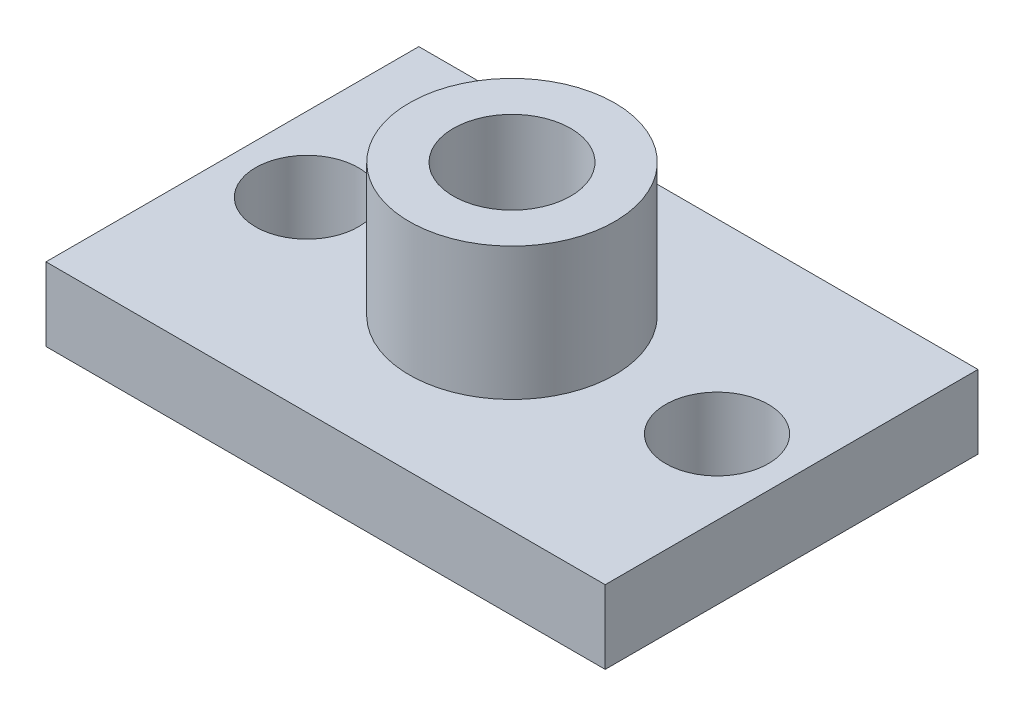
ISO-10303-21;
HEADER;
FILE_DESCRIPTION(('STEP AP214'),'2;1');
FILE_NAME('part.step','',(''),(''),'','','');
FILE_SCHEMA(('AUTOMOTIVE_DESIGN { 1 0 10303 214 1 1 1 1 }'));
ENDSEC;
DATA;
#1=APPLICATION_CONTEXT('core data for automotive mechanical design processes');
#2=APPLICATION_PROTOCOL_DEFINITION('international standard','automotive_design',2000,#1);
#3=PRODUCT_CONTEXT('',#1,'mechanical');
#4=PRODUCT('Part','Part','',(#3));
#5=PRODUCT_RELATED_PRODUCT_CATEGORY('part','',(#4));
#6=PRODUCT_DEFINITION_FORMATION('','',#4);
#7=PRODUCT_DEFINITION_CONTEXT('part definition',#1,'design');
#8=PRODUCT_DEFINITION('design','',#6,#7);
#9=PRODUCT_DEFINITION_SHAPE('','',#8);
#10=(LENGTH_UNIT() NAMED_UNIT(*) SI_UNIT(.MILLI.,.METRE.));
#11=(NAMED_UNIT(*) PLANE_ANGLE_UNIT() SI_UNIT($,.RADIAN.));
#12=(NAMED_UNIT(*) SI_UNIT($,.STERADIAN.) SOLID_ANGLE_UNIT());
#13=UNCERTAINTY_MEASURE_WITH_UNIT(LENGTH_MEASURE(1.E-05),#10,'distance_accuracy_value','');
#14=(GEOMETRIC_REPRESENTATION_CONTEXT(3) GLOBAL_UNCERTAINTY_ASSIGNED_CONTEXT((#13)) GLOBAL_UNIT_ASSIGNED_CONTEXT((#10,
#11,#12)) REPRESENTATION_CONTEXT('',''));
#15=CARTESIAN_POINT('',(0.,0.,0.));
#16=DIRECTION('',(0.,0.,1.));
#17=DIRECTION('',(1.,0.,0.));
#18=AXIS2_PLACEMENT_3D('',#15,#16,#17);
#19=CARTESIAN_POINT('',(0.,5.,0.));
#20=DIRECTION('',(0.,1.,0.));
#21=DIRECTION('',(0.,0.,1.));
#22=AXIS2_PLACEMENT_3D('',#19,#20,#21);
#23=PLANE('',#22);
#24=CARTESIAN_POINT('',(-20.7617391304348,5.,0.));
#25=DIRECTION('',(0.,1.,0.));
#26=DIRECTION('',(0.,0.,1.));
#27=AXIS2_PLACEMENT_3D('',#24,#25,#26);
#28=CIRCLE('',#27,3.5);
#29=CARTESIAN_POINT('',(-20.7617391304348,5.,3.5));
#30=VERTEX_POINT('',#29);
#31=EDGE_CURVE('E166',#30,#30,#28,.T.);
#32=ORIENTED_EDGE('',*,*,#31,.F.);
#33=EDGE_LOOP('',(#32));
#34=FACE_BOUND('',#33,.T.);
#35=CARTESIAN_POINT('',(7.17826086956524,5.,0.));
#36=DIRECTION('',(0.,1.,0.));
#37=DIRECTION('',(0.,0.,1.));
#38=AXIS2_PLACEMENT_3D('',#35,#36,#37);
#39=CIRCLE('',#38,3.5);
#40=CARTESIAN_POINT('',(7.17826086956524,5.,3.5));
#41=VERTEX_POINT('',#40);
#42=EDGE_CURVE('E168',#41,#41,#39,.T.);
#43=ORIENTED_EDGE('',*,*,#42,.F.);
#44=EDGE_LOOP('',(#43));
#45=FACE_BOUND('',#44,.T.);
#46=DIRECTION('',(0.,0.,1.));
#47=VECTOR('',#46,1.);
#48=CARTESIAN_POINT('',(-25.8417391304348,5.,-12.7));
#49=LINE('',#48,#47);
#50=CARTESIAN_POINT('',(-25.8417391304348,5.,-12.7));
#51=VERTEX_POINT('',#50);
#52=CARTESIAN_POINT('',(-25.8417391304348,5.,12.7));
#53=VERTEX_POINT('',#52);
#54=EDGE_CURVE('E86',#51,#53,#49,.T.);
#55=ORIENTED_EDGE('',*,*,#54,.T.);
#56=DIRECTION('',(1.,0.,0.));
#57=VECTOR('',#56,1.);
#58=CARTESIAN_POINT('',(-25.8417391304348,5.,12.7));
#59=LINE('',#58,#57);
#60=CARTESIAN_POINT('',(12.2582608695652,5.,12.7));
#61=VERTEX_POINT('',#60);
#62=EDGE_CURVE('E81',#53,#61,#59,.T.);
#63=ORIENTED_EDGE('',*,*,#62,.T.);
#64=DIRECTION('',(0.,0.,-1.));
#65=VECTOR('',#64,1.);
#66=CARTESIAN_POINT('',(12.2582608695652,5.,-12.7));
#67=LINE('',#66,#65);
#68=CARTESIAN_POINT('',(12.2582608695652,5.,-12.7));
#69=VERTEX_POINT('',#68);
#70=EDGE_CURVE('E84',#61,#69,#67,.T.);
#71=ORIENTED_EDGE('',*,*,#70,.T.);
#72=DIRECTION('',(-1.,0.,0.));
#73=VECTOR('',#72,1.);
#74=CARTESIAN_POINT('',(-25.8417391304348,5.,-12.7));
#75=LINE('',#74,#73);
#76=EDGE_CURVE('E50',#69,#51,#75,.T.);
#77=ORIENTED_EDGE('',*,*,#76,.T.);
#78=EDGE_LOOP('',(#55,#63,#71,#77));
#79=FACE_BOUND('',#78,.T.);
#80=CARTESIAN_POINT('',(-6.79173913043476,5.,0.));
#81=DIRECTION('',(0.,1.,0.));
#82=DIRECTION('',(0.,0.,1.));
#83=AXIS2_PLACEMENT_3D('',#80,#81,#82);
#84=CIRCLE('',#83,7.);
#85=CARTESIAN_POINT('',(-6.79173913043476,5.,-7.00000000000001));
#86=VERTEX_POINT('',#85);
#87=EDGE_CURVE('E178',#86,#86,#84,.T.);
#88=ORIENTED_EDGE('',*,*,#87,.F.);
#89=EDGE_LOOP('',(#88));
#90=FACE_BOUND('',#89,.T.);
#91=ADVANCED_FACE('F33',(#34,#45,#79,#90),#23,.T.);
#92=CARTESIAN_POINT('',(-25.8417391304348,5.,-12.7));
#93=DIRECTION('',(1.,0.,0.));
#94=DIRECTION('',(0.,0.,-1.));
#95=AXIS2_PLACEMENT_3D('',#92,#93,#94);
#96=PLANE('',#95);
#97=DIRECTION('',(0.,0.,1.));
#98=VECTOR('',#97,1.);
#99=CARTESIAN_POINT('',(-25.8417391304348,0.,-12.7));
#100=LINE('',#99,#98);
#101=CARTESIAN_POINT('',(-25.8417391304348,0.,-12.7));
#102=VERTEX_POINT('',#101);
#103=CARTESIAN_POINT('',(-25.8417391304348,0.,12.7));
#104=VERTEX_POINT('',#103);
#105=EDGE_CURVE('E100',#102,#104,#100,.T.);
#106=ORIENTED_EDGE('',*,*,#105,.T.);
#107=DIRECTION('',(0.,-1.,0.));
#108=VECTOR('',#107,1.);
#109=CARTESIAN_POINT('',(-25.8417391304348,5.,12.7));
#110=LINE('',#109,#108);
#111=EDGE_CURVE('E42',#53,#104,#110,.T.);
#112=ORIENTED_EDGE('',*,*,#111,.F.);
#113=ORIENTED_EDGE('',*,*,#54,.F.);
#114=DIRECTION('',(0.,-1.,0.));
#115=VECTOR('',#114,1.);
#116=CARTESIAN_POINT('',(-25.8417391304348,5.,-12.7));
#117=LINE('',#116,#115);
#118=EDGE_CURVE('E96',#51,#102,#117,.T.);
#119=ORIENTED_EDGE('',*,*,#118,.T.);
#120=EDGE_LOOP('',(#106,#112,#113,#119));
#121=FACE_BOUND('',#120,.T.);
#122=ADVANCED_FACE('F35',(#121),#96,.F.);
#123=CARTESIAN_POINT('',(-25.8417391304348,5.,12.7));
#124=DIRECTION('',(0.,0.,-1.));
#125=DIRECTION('',(-1.,0.,0.));
#126=AXIS2_PLACEMENT_3D('',#123,#124,#125);
#127=PLANE('',#126);
#128=DIRECTION('',(1.,0.,0.));
#129=VECTOR('',#128,1.);
#130=CARTESIAN_POINT('',(-25.8417391304348,0.,12.7));
#131=LINE('',#130,#129);
#132=CARTESIAN_POINT('',(12.2582608695652,0.,12.7));
#133=VERTEX_POINT('',#132);
#134=EDGE_CURVE('E91',#104,#133,#131,.T.);
#135=ORIENTED_EDGE('',*,*,#134,.T.);
#136=DIRECTION('',(0.,-1.,0.));
#137=VECTOR('',#136,1.);
#138=CARTESIAN_POINT('',(12.2582608695652,5.,12.7));
#139=LINE('',#138,#137);
#140=EDGE_CURVE('E89',#61,#133,#139,.T.);
#141=ORIENTED_EDGE('',*,*,#140,.F.);
#142=ORIENTED_EDGE('',*,*,#62,.F.);
#143=ORIENTED_EDGE('',*,*,#111,.T.);
#144=EDGE_LOOP('',(#135,#141,#142,#143));
#145=FACE_BOUND('',#144,.T.);
#146=ADVANCED_FACE('F90',(#145),#127,.F.);
#147=CARTESIAN_POINT('',(12.2582608695652,5.,-12.7));
#148=DIRECTION('',(-1.,0.,0.));
#149=DIRECTION('',(0.,0.,1.));
#150=AXIS2_PLACEMENT_3D('',#147,#148,#149);
#151=PLANE('',#150);
#152=DIRECTION('',(0.,0.,-1.));
#153=VECTOR('',#152,1.);
#154=CARTESIAN_POINT('',(12.2582608695652,0.,-12.7));
#155=LINE('',#154,#153);
#156=CARTESIAN_POINT('',(12.2582608695652,0.,-12.7));
#157=VERTEX_POINT('',#156);
#158=EDGE_CURVE('E67',#133,#157,#155,.T.);
#159=ORIENTED_EDGE('',*,*,#158,.T.);
#160=DIRECTION('',(0.,-1.,0.));
#161=VECTOR('',#160,1.);
#162=CARTESIAN_POINT('',(12.2582608695652,5.,-12.7));
#163=LINE('',#162,#161);
#164=EDGE_CURVE('E92',#69,#157,#163,.T.);
#165=ORIENTED_EDGE('',*,*,#164,.F.);
#166=ORIENTED_EDGE('',*,*,#70,.F.);
#167=ORIENTED_EDGE('',*,*,#140,.T.);
#168=EDGE_LOOP('',(#159,#165,#166,#167));
#169=FACE_BOUND('',#168,.T.);
#170=ADVANCED_FACE('F94',(#169),#151,.F.);
#171=CARTESIAN_POINT('',(-25.8417391304348,5.,-12.7));
#172=DIRECTION('',(0.,0.,1.));
#173=DIRECTION('',(1.,0.,0.));
#174=AXIS2_PLACEMENT_3D('',#171,#172,#173);
#175=PLANE('',#174);
#176=DIRECTION('',(-1.,0.,0.));
#177=VECTOR('',#176,1.);
#178=CARTESIAN_POINT('',(-25.8417391304348,0.,-12.7));
#179=LINE('',#178,#177);
#180=EDGE_CURVE('E73',#157,#102,#179,.T.);
#181=ORIENTED_EDGE('',*,*,#180,.T.);
#182=ORIENTED_EDGE('',*,*,#118,.F.);
#183=ORIENTED_EDGE('',*,*,#76,.F.);
#184=ORIENTED_EDGE('',*,*,#164,.T.);
#185=EDGE_LOOP('',(#181,#182,#183,#184));
#186=FACE_BOUND('',#185,.T.);
#187=ADVANCED_FACE('F114',(#186),#175,.F.);
#188=CARTESIAN_POINT('',(0.,0.,0.));
#189=DIRECTION('',(0.,1.,0.));
#190=DIRECTION('',(0.,0.,1.));
#191=AXIS2_PLACEMENT_3D('',#188,#189,#190);
#192=PLANE('',#191);
#193=CARTESIAN_POINT('',(-20.7617391304348,0.,0.));
#194=DIRECTION('',(0.,1.,0.));
#195=DIRECTION('',(0.,0.,1.));
#196=AXIS2_PLACEMENT_3D('',#193,#194,#195);
#197=CIRCLE('',#196,3.5);
#198=CARTESIAN_POINT('',(-20.7617391304348,0.,3.5));
#199=VERTEX_POINT('',#198);
#200=EDGE_CURVE('E164',#199,#199,#197,.T.);
#201=ORIENTED_EDGE('',*,*,#200,.T.);
#202=EDGE_LOOP('',(#201));
#203=FACE_BOUND('',#202,.T.);
#204=CARTESIAN_POINT('',(7.17826086956524,0.,0.));
#205=DIRECTION('',(0.,1.,0.));
#206=DIRECTION('',(0.,0.,1.));
#207=AXIS2_PLACEMENT_3D('',#204,#205,#206);
#208=CIRCLE('',#207,3.5);
#209=CARTESIAN_POINT('',(7.17826086956524,0.,3.5));
#210=VERTEX_POINT('',#209);
#211=EDGE_CURVE('E171',#210,#210,#208,.T.);
#212=ORIENTED_EDGE('',*,*,#211,.T.);
#213=EDGE_LOOP('',(#212));
#214=FACE_BOUND('',#213,.T.);
#215=ORIENTED_EDGE('',*,*,#105,.F.);
#216=ORIENTED_EDGE('',*,*,#180,.F.);
#217=ORIENTED_EDGE('',*,*,#158,.F.);
#218=ORIENTED_EDGE('',*,*,#134,.F.);
#219=EDGE_LOOP('',(#215,#216,#217,#218));
#220=FACE_BOUND('',#219,.T.);
#221=ADVANCED_FACE('F111',(#203,#214,#220),#192,.F.);
#222=CARTESIAN_POINT('',(-6.79173913043476,14.05,0.));
#223=DIRECTION('',(0.,1.,0.));
#224=DIRECTION('',(0.,0.,1.));
#225=AXIS2_PLACEMENT_3D('',#222,#223,#224);
#226=PLANE('',#225);
#227=CARTESIAN_POINT('',(-6.79173913043476,14.05,0.));
#228=DIRECTION('',(0.,1.,0.));
#229=DIRECTION('',(0.,0.,1.));
#230=AXIS2_PLACEMENT_3D('',#227,#228,#229);
#231=CIRCLE('',#230,7.);
#232=CARTESIAN_POINT('',(-6.79173913043476,14.05,-7.00000000000001));
#233=VERTEX_POINT('',#232);
#234=EDGE_CURVE('E103',#233,#233,#231,.T.);
#235=ORIENTED_EDGE('',*,*,#234,.T.);
#236=EDGE_LOOP('',(#235));
#237=FACE_BOUND('',#236,.T.);
#238=CARTESIAN_POINT('',(-6.79173913043476,14.05,0.));
#239=DIRECTION('',(0.,1.,0.));
#240=DIRECTION('',(0.,0.,1.));
#241=AXIS2_PLACEMENT_3D('',#238,#239,#240);
#242=CIRCLE('',#241,4.);
#243=CARTESIAN_POINT('',(-6.79173913043476,14.05,-4.00000000000001));
#244=VERTEX_POINT('',#243);
#245=EDGE_CURVE('E174',#244,#244,#242,.T.);
#246=ORIENTED_EDGE('',*,*,#245,.F.);
#247=EDGE_LOOP('',(#246));
#248=FACE_BOUND('',#247,.T.);
#249=ADVANCED_FACE('F113',(#237,#248),#226,.T.);
#250=CARTESIAN_POINT('',(-6.79173913043476,14.05,0.));
#251=DIRECTION('',(0.,-1.,0.));
#252=DIRECTION('',(0.,0.,-1.));
#253=AXIS2_PLACEMENT_3D('',#250,#251,#252);
#254=CYLINDRICAL_SURFACE('',#253,7.);
#255=CARTESIAN_POINT('',(-6.79173913043476,14.05,-7.00000000000001));
#256=CARTESIAN_POINT('',(-6.79173913043476,13.9557291666667,-7.00000000000001));
#257=CARTESIAN_POINT('',(-6.79173913043476,13.8614583333333,-7.00000000000001));
#258=CARTESIAN_POINT('',(-6.79173913043476,13.6729166666667,-7.00000000000001));
#259=CARTESIAN_POINT('',(-6.79173913043476,13.5786458333333,-7.00000000000001));
#260=CARTESIAN_POINT('',(-6.79173913043476,13.3901041666667,-7.00000000000001));
#261=CARTESIAN_POINT('',(-6.79173913043476,13.2958333333333,-7.00000000000001));
#262=CARTESIAN_POINT('',(-6.79173913043476,13.1072916666667,-7.00000000000001));
#263=CARTESIAN_POINT('',(-6.79173913043476,13.0130208333333,-7.00000000000001));
#264=CARTESIAN_POINT('',(-6.79173913043476,12.8244791666667,-7.00000000000001));
#265=CARTESIAN_POINT('',(-6.79173913043476,12.7302083333333,-7.00000000000001));
#266=CARTESIAN_POINT('',(-6.79173913043476,12.5416666666667,-7.00000000000001));
#267=CARTESIAN_POINT('',(-6.79173913043476,12.4473958333333,-7.00000000000001));
#268=CARTESIAN_POINT('',(-6.79173913043476,12.2588541666667,-7.00000000000001));
#269=CARTESIAN_POINT('',(-6.79173913043476,12.1645833333333,-7.00000000000001));
#270=CARTESIAN_POINT('',(-6.79173913043476,11.9760416666667,-7.00000000000001));
#271=CARTESIAN_POINT('',(-6.79173913043476,11.8817708333333,-7.00000000000001));
#272=CARTESIAN_POINT('',(-6.79173913043476,11.6932291666667,-7.00000000000001));
#273=CARTESIAN_POINT('',(-6.79173913043476,11.5989583333333,-7.00000000000001));
#274=CARTESIAN_POINT('',(-6.79173913043476,11.4104166666667,-7.00000000000001));
#275=CARTESIAN_POINT('',(-6.79173913043476,11.3161458333333,-7.00000000000001));
#276=CARTESIAN_POINT('',(-6.79173913043476,11.1276041666667,-7.00000000000001));
#277=CARTESIAN_POINT('',(-6.79173913043476,11.0333333333333,-7.00000000000001));
#278=CARTESIAN_POINT('',(-6.79173913043476,10.8447916666667,-7.00000000000001));
#279=CARTESIAN_POINT('',(-6.79173913043476,10.7505208333333,-7.00000000000001));
#280=CARTESIAN_POINT('',(-6.79173913043476,10.5619791666667,-7.00000000000001));
#281=CARTESIAN_POINT('',(-6.79173913043476,10.4677083333333,-7.00000000000001));
#282=CARTESIAN_POINT('',(-6.79173913043476,10.2791666666667,-7.00000000000001));
#283=CARTESIAN_POINT('',(-6.79173913043476,10.1848958333333,-7.00000000000001));
#284=CARTESIAN_POINT('',(-6.79173913043476,9.99635416666667,-7.00000000000001));
#285=CARTESIAN_POINT('',(-6.79173913043476,9.90208333333333,-7.00000000000001));
#286=CARTESIAN_POINT('',(-6.79173913043476,9.71354166666667,-7.00000000000001));
#287=CARTESIAN_POINT('',(-6.79173913043476,9.61927083333333,-7.00000000000001));
#288=CARTESIAN_POINT('',(-6.79173913043476,9.43072916666667,-7.00000000000001));
#289=CARTESIAN_POINT('',(-6.79173913043476,9.33645833333333,-7.00000000000001));
#290=CARTESIAN_POINT('',(-6.79173913043476,9.14791666666667,-7.00000000000001));
#291=CARTESIAN_POINT('',(-6.79173913043476,9.05364583333333,-7.00000000000001));
#292=CARTESIAN_POINT('',(-6.79173913043476,8.86510416666667,-7.00000000000001));
#293=CARTESIAN_POINT('',(-6.79173913043476,8.77083333333333,-7.00000000000001));
#294=CARTESIAN_POINT('',(-6.79173913043476,8.58229166666666,-7.00000000000001));
#295=CARTESIAN_POINT('',(-6.79173913043476,8.48802083333333,-7.00000000000001));
#296=CARTESIAN_POINT('',(-6.79173913043476,8.29947916666666,-7.00000000000001));
#297=CARTESIAN_POINT('',(-6.79173913043476,8.20520833333333,-7.00000000000001));
#298=CARTESIAN_POINT('',(-6.79173913043476,8.01666666666667,-7.00000000000001));
#299=CARTESIAN_POINT('',(-6.79173913043476,7.92239583333333,-7.00000000000001));
#300=CARTESIAN_POINT('',(-6.79173913043476,7.73385416666667,-7.00000000000001));
#301=CARTESIAN_POINT('',(-6.79173913043476,7.63958333333333,-7.00000000000001));
#302=CARTESIAN_POINT('',(-6.79173913043476,7.45104166666667,-7.00000000000001));
#303=CARTESIAN_POINT('',(-6.79173913043476,7.35677083333333,-7.00000000000001));
#304=CARTESIAN_POINT('',(-6.79173913043476,7.16822916666666,-7.00000000000001));
#305=CARTESIAN_POINT('',(-6.79173913043476,7.07395833333333,-7.00000000000001));
#306=CARTESIAN_POINT('',(-6.79173913043476,6.88541666666666,-7.00000000000001));
#307=CARTESIAN_POINT('',(-6.79173913043476,6.79114583333333,-7.00000000000001));
#308=CARTESIAN_POINT('',(-6.79173913043476,6.60260416666666,-7.00000000000001));
#309=CARTESIAN_POINT('',(-6.79173913043476,6.50833333333333,-7.00000000000001));
#310=CARTESIAN_POINT('',(-6.79173913043476,6.31979166666667,-7.00000000000001));
#311=CARTESIAN_POINT('',(-6.79173913043476,6.22552083333333,-7.00000000000001));
#312=CARTESIAN_POINT('',(-6.79173913043476,6.03697916666667,-7.00000000000001));
#313=CARTESIAN_POINT('',(-6.79173913043476,5.94270833333333,-7.00000000000001));
#314=CARTESIAN_POINT('',(-6.79173913043476,5.75416666666667,-7.00000000000001));
#315=CARTESIAN_POINT('',(-6.79173913043476,5.65989583333333,-7.00000000000001));
#316=CARTESIAN_POINT('',(-6.79173913043476,5.47135416666667,-7.00000000000001));
#317=CARTESIAN_POINT('',(-6.79173913043476,5.37708333333333,-7.00000000000001));
#318=CARTESIAN_POINT('',(-6.79173913043476,5.18854166666667,-7.00000000000001));
#319=CARTESIAN_POINT('',(-6.79173913043476,5.09427083333333,-7.00000000000001));
#320=CARTESIAN_POINT('',(-6.79173913043476,5.,-7.00000000000001));
#321=B_SPLINE_CURVE_WITH_KNOTS('',3,(#255,#256,#257,#258,#259,#260,#261,#262,#263,#264,#265,
#266,#267,#268,#269,#270,#271,#272,#273,#274,#275,#276,#277,#278,#279,#280,#281,#282,#283,#284,
#285,#286,#287,#288,#289,#290,#291,#292,#293,#294,#295,#296,#297,#298,#299,#300,#301,#302,#303,
#304,#305,#306,#307,#308,#309,#310,#311,#312,#313,#314,#315,#316,#317,#318,#319,#320),
.UNSPECIFIED.,.F.,.F.,(4,2,2,2,2,2,2,2,2,2,2,2,2,2,2,2,2,2,2,2,2,2,2,2,2,2,2,2,2,2,2,2,4),(0.,
0.2828125,0.565625,0.8484375,1.13125,1.4140625,1.696875,1.9796875,2.2625,2.5453125,2.828125,
3.1109375,3.39375,3.6765625,3.959375,4.2421875,4.525,4.8078125,5.090625,5.3734375,5.65625,
5.9390625,6.221875,6.5046875,6.7875,7.0703125,7.353125,7.6359375,7.91875,8.2015625,8.484375,
8.7671875,9.05),.UNSPECIFIED.);
#322=EDGE_CURVE('BSEAM121',#233,#86,#321,.T.);
#323=ORIENTED_EDGE('',*,*,#234,.F.);
#324=ORIENTED_EDGE('',*,*,#87,.T.);
#325=ORIENTED_EDGE('',*,*,#322,.T.);
#326=ORIENTED_EDGE('',*,*,#322,.F.);
#327=EDGE_LOOP('',(#323,#325,#324,#326));
#328=FACE_BOUND('',#327,.T.);
#329=ADVANCED_FACE('F121',(#328),#254,.T.);
#330=CARTESIAN_POINT('',(-6.79173913043476,14.05,0.));
#331=DIRECTION('',(0.,-1.,0.));
#332=DIRECTION('',(0.,0.,-1.));
#333=AXIS2_PLACEMENT_3D('',#330,#331,#332);
#334=CYLINDRICAL_SURFACE('',#333,4.);
#335=CARTESIAN_POINT('',(-6.79173913043476,5.,0.));
#336=DIRECTION('',(0.,1.,0.));
#337=DIRECTION('',(0.,0.,1.));
#338=AXIS2_PLACEMENT_3D('',#335,#336,#337);
#339=CIRCLE('',#338,4.);
#340=CARTESIAN_POINT('',(-6.79173913043476,5.,-4.00000000000001));
#341=VERTEX_POINT('',#340);
#342=EDGE_CURVE('E11',#341,#341,#339,.F.);
#343=CARTESIAN_POINT('',(-6.79173913043476,14.05,-4.00000000000001));
#344=CARTESIAN_POINT('',(-6.79173913043476,13.9557291666667,-4.00000000000001));
#345=CARTESIAN_POINT('',(-6.79173913043476,13.8614583333333,-4.00000000000001));
#346=CARTESIAN_POINT('',(-6.79173913043476,13.6729166666667,-4.00000000000001));
#347=CARTESIAN_POINT('',(-6.79173913043476,13.5786458333333,-4.00000000000001));
#348=CARTESIAN_POINT('',(-6.79173913043476,13.3901041666667,-4.00000000000001));
#349=CARTESIAN_POINT('',(-6.79173913043476,13.2958333333333,-4.00000000000001));
#350=CARTESIAN_POINT('',(-6.79173913043476,13.1072916666667,-4.00000000000001));
#351=CARTESIAN_POINT('',(-6.79173913043476,13.0130208333333,-4.00000000000001));
#352=CARTESIAN_POINT('',(-6.79173913043476,12.8244791666667,-4.00000000000001));
#353=CARTESIAN_POINT('',(-6.79173913043476,12.7302083333333,-4.00000000000001));
#354=CARTESIAN_POINT('',(-6.79173913043476,12.5416666666667,-4.00000000000001));
#355=CARTESIAN_POINT('',(-6.79173913043476,12.4473958333333,-4.00000000000001));
#356=CARTESIAN_POINT('',(-6.79173913043476,12.2588541666667,-4.00000000000001));
#357=CARTESIAN_POINT('',(-6.79173913043476,12.1645833333333,-4.00000000000001));
#358=CARTESIAN_POINT('',(-6.79173913043476,11.9760416666667,-4.00000000000001));
#359=CARTESIAN_POINT('',(-6.79173913043476,11.8817708333333,-4.00000000000001));
#360=CARTESIAN_POINT('',(-6.79173913043476,11.6932291666667,-4.00000000000001));
#361=CARTESIAN_POINT('',(-6.79173913043476,11.5989583333333,-4.00000000000001));
#362=CARTESIAN_POINT('',(-6.79173913043476,11.4104166666667,-4.00000000000001));
#363=CARTESIAN_POINT('',(-6.79173913043476,11.3161458333333,-4.00000000000001));
#364=CARTESIAN_POINT('',(-6.79173913043476,11.1276041666667,-4.00000000000001));
#365=CARTESIAN_POINT('',(-6.79173913043476,11.0333333333333,-4.00000000000001));
#366=CARTESIAN_POINT('',(-6.79173913043476,10.8447916666667,-4.00000000000001));
#367=CARTESIAN_POINT('',(-6.79173913043476,10.7505208333333,-4.00000000000001));
#368=CARTESIAN_POINT('',(-6.79173913043476,10.5619791666667,-4.00000000000001));
#369=CARTESIAN_POINT('',(-6.79173913043476,10.4677083333333,-4.00000000000001));
#370=CARTESIAN_POINT('',(-6.79173913043476,10.2791666666667,-4.00000000000001));
#371=CARTESIAN_POINT('',(-6.79173913043476,10.1848958333333,-4.00000000000001));
#372=CARTESIAN_POINT('',(-6.79173913043476,9.99635416666667,-4.00000000000001));
#373=CARTESIAN_POINT('',(-6.79173913043476,9.90208333333333,-4.00000000000001));
#374=CARTESIAN_POINT('',(-6.79173913043476,9.71354166666667,-4.00000000000001));
#375=CARTESIAN_POINT('',(-6.79173913043476,9.61927083333333,-4.00000000000001));
#376=CARTESIAN_POINT('',(-6.79173913043476,9.43072916666667,-4.00000000000001));
#377=CARTESIAN_POINT('',(-6.79173913043476,9.33645833333333,-4.00000000000001));
#378=CARTESIAN_POINT('',(-6.79173913043476,9.14791666666667,-4.00000000000001));
#379=CARTESIAN_POINT('',(-6.79173913043476,9.05364583333333,-4.00000000000001));
#380=CARTESIAN_POINT('',(-6.79173913043476,8.86510416666667,-4.00000000000001));
#381=CARTESIAN_POINT('',(-6.79173913043476,8.77083333333333,-4.00000000000001));
#382=CARTESIAN_POINT('',(-6.79173913043476,8.58229166666666,-4.00000000000001));
#383=CARTESIAN_POINT('',(-6.79173913043476,8.48802083333333,-4.00000000000001));
#384=CARTESIAN_POINT('',(-6.79173913043476,8.29947916666666,-4.00000000000001));
#385=CARTESIAN_POINT('',(-6.79173913043476,8.20520833333333,-4.00000000000001));
#386=CARTESIAN_POINT('',(-6.79173913043476,8.01666666666667,-4.00000000000001));
#387=CARTESIAN_POINT('',(-6.79173913043476,7.92239583333333,-4.00000000000001));
#388=CARTESIAN_POINT('',(-6.79173913043476,7.73385416666667,-4.00000000000001));
#389=CARTESIAN_POINT('',(-6.79173913043476,7.63958333333333,-4.00000000000001));
#390=CARTESIAN_POINT('',(-6.79173913043476,7.45104166666667,-4.00000000000001));
#391=CARTESIAN_POINT('',(-6.79173913043476,7.35677083333333,-4.00000000000001));
#392=CARTESIAN_POINT('',(-6.79173913043476,7.16822916666667,-4.00000000000001));
#393=CARTESIAN_POINT('',(-6.79173913043476,7.07395833333333,-4.00000000000001));
#394=CARTESIAN_POINT('',(-6.79173913043476,6.88541666666667,-4.00000000000001));
#395=CARTESIAN_POINT('',(-6.79173913043476,6.79114583333333,-4.00000000000001));
#396=CARTESIAN_POINT('',(-6.79173913043476,6.60260416666667,-4.00000000000001));
#397=CARTESIAN_POINT('',(-6.79173913043476,6.50833333333333,-4.00000000000001));
#398=CARTESIAN_POINT('',(-6.79173913043476,6.31979166666667,-4.00000000000001));
#399=CARTESIAN_POINT('',(-6.79173913043476,6.22552083333333,-4.00000000000001));
#400=CARTESIAN_POINT('',(-6.79173913043476,6.03697916666667,-4.00000000000001));
#401=CARTESIAN_POINT('',(-6.79173913043476,5.94270833333333,-4.00000000000001));
#402=CARTESIAN_POINT('',(-6.79173913043476,5.75416666666667,-4.00000000000001));
#403=CARTESIAN_POINT('',(-6.79173913043476,5.65989583333333,-4.00000000000001));
#404=CARTESIAN_POINT('',(-6.79173913043476,5.47135416666667,-4.00000000000001));
#405=CARTESIAN_POINT('',(-6.79173913043476,5.37708333333333,-4.00000000000001));
#406=CARTESIAN_POINT('',(-6.79173913043476,5.18854166666667,-4.00000000000001));
#407=CARTESIAN_POINT('',(-6.79173913043476,5.09427083333333,-4.00000000000001));
#408=CARTESIAN_POINT('',(-6.79173913043476,5.,-4.00000000000001));
#409=B_SPLINE_CURVE_WITH_KNOTS('',3,(#343,#344,#345,#346,#347,#348,#349,#350,#351,#352,#353,
#354,#355,#356,#357,#358,#359,#360,#361,#362,#363,#364,#365,#366,#367,#368,#369,#370,#371,#372,
#373,#374,#375,#376,#377,#378,#379,#380,#381,#382,#383,#384,#385,#386,#387,#388,#389,#390,#391,
#392,#393,#394,#395,#396,#397,#398,#399,#400,#401,#402,#403,#404,#405,#406,#407,#408),
.UNSPECIFIED.,.F.,.F.,(4,2,2,2,2,2,2,2,2,2,2,2,2,2,2,2,2,2,2,2,2,2,2,2,2,2,2,2,2,2,2,2,4),(0.,
0.282812499999998,0.565624999999998,0.848437499999999,1.13125,1.4140625,1.696875,1.9796875,
2.2625,2.5453125,2.828125,3.1109375,3.39375,3.6765625,3.959375,4.2421875,4.525,4.8078125,
5.090625,5.3734375,5.65625,5.9390625,6.221875,6.5046875,6.7875,7.0703125,7.353125,7.6359375,
7.91875,8.2015625,8.484375,8.7671875,9.05),.UNSPECIFIED.);
#410=EDGE_CURVE('BSEAM139',#244,#341,#409,.T.);
#411=ORIENTED_EDGE('',*,*,#245,.T.);
#412=ORIENTED_EDGE('',*,*,#342,.T.);
#413=ORIENTED_EDGE('',*,*,#410,.T.);
#414=ORIENTED_EDGE('',*,*,#410,.F.);
#415=EDGE_LOOP('',(#411,#413,#412,#414));
#416=FACE_BOUND('',#415,.T.);
#417=ADVANCED_FACE('F139',(#416),#334,.F.);
#418=ORIENTED_EDGE('',*,*,#342,.F.);
#419=EDGE_LOOP('',(#418));
#420=FACE_BOUND('',#419,.T.);
#421=ADVANCED_FACE('F130',(#420),#23,.T.);
#422=CARTESIAN_POINT('',(7.17826086956524,0.,0.));
#423=DIRECTION('',(0.,1.,0.));
#424=DIRECTION('',(0.,0.,1.));
#425=AXIS2_PLACEMENT_3D('',#422,#423,#424);
#426=CYLINDRICAL_SURFACE('',#425,3.5);
#427=ORIENTED_EDGE('',*,*,#211,.F.);
#428=EDGE_LOOP('',(#427));
#429=FACE_BOUND('',#428,.T.);
#430=ORIENTED_EDGE('',*,*,#42,.T.);
#431=EDGE_LOOP('',(#430));
#432=FACE_BOUND('',#431,.T.);
#433=ADVANCED_FACE('F138',(#429,#432),#426,.F.);
#434=CARTESIAN_POINT('',(-20.7617391304348,0.,0.));
#435=DIRECTION('',(0.,1.,0.));
#436=DIRECTION('',(0.,0.,1.));
#437=AXIS2_PLACEMENT_3D('',#434,#435,#436);
#438=CYLINDRICAL_SURFACE('',#437,3.5);
#439=ORIENTED_EDGE('',*,*,#200,.F.);
#440=EDGE_LOOP('',(#439));
#441=FACE_BOUND('',#440,.T.);
#442=ORIENTED_EDGE('',*,*,#31,.T.);
#443=EDGE_LOOP('',(#442));
#444=FACE_BOUND('',#443,.T.);
#445=ADVANCED_FACE('F145',(#441,#444),#438,.F.);
#446=CLOSED_SHELL('',(#91,#122,#146,#170,#187,#221,#249,#329,#417,#421,#433,#445));
#447=MANIFOLD_SOLID_BREP('B2',#446);
#448=ADVANCED_BREP_SHAPE_REPRESENTATION('',(#18,#447),#14);
#449=SHAPE_DEFINITION_REPRESENTATION(#9,#448);
ENDSEC;
END-ISO-10303-21;
